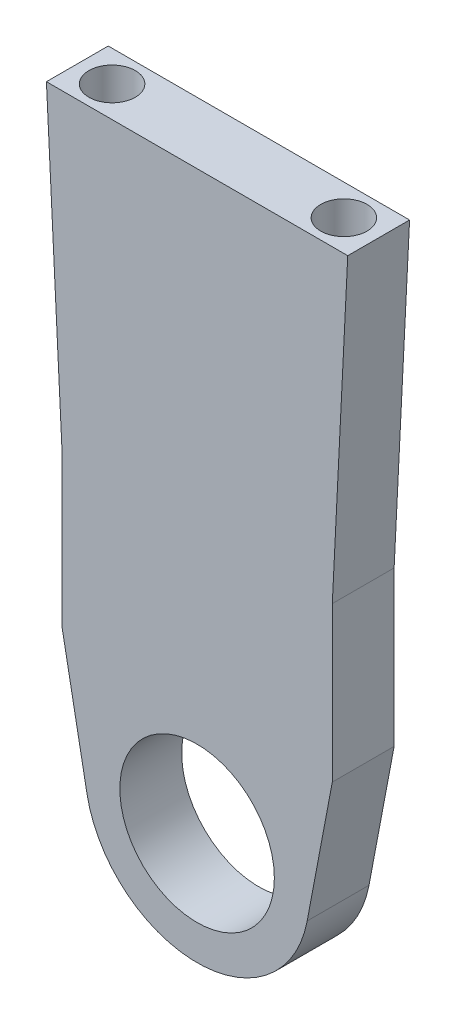
ISO-10303-21;
HEADER;
FILE_DESCRIPTION(('STEP AP214'),'2;1');
FILE_NAME('part.step','',(''),(''),'','','');
FILE_SCHEMA(('AUTOMOTIVE_DESIGN { 1 0 10303 214 1 1 1 1 }'));
ENDSEC;
DATA;
#1=APPLICATION_CONTEXT('core data for automotive mechanical design processes');
#2=APPLICATION_PROTOCOL_DEFINITION('international standard','automotive_design',2000,#1);
#3=PRODUCT_CONTEXT('',#1,'mechanical');
#4=PRODUCT('Part','Part','',(#3));
#5=PRODUCT_RELATED_PRODUCT_CATEGORY('part','',(#4));
#6=PRODUCT_DEFINITION_FORMATION('','',#4);
#7=PRODUCT_DEFINITION_CONTEXT('part definition',#1,'design');
#8=PRODUCT_DEFINITION('design','',#6,#7);
#9=PRODUCT_DEFINITION_SHAPE('','',#8);
#10=(LENGTH_UNIT() NAMED_UNIT(*) SI_UNIT(.MILLI.,.METRE.));
#11=(NAMED_UNIT(*) PLANE_ANGLE_UNIT() SI_UNIT($,.RADIAN.));
#12=(NAMED_UNIT(*) SI_UNIT($,.STERADIAN.) SOLID_ANGLE_UNIT());
#13=UNCERTAINTY_MEASURE_WITH_UNIT(LENGTH_MEASURE(1.E-05),#10,'distance_accuracy_value','');
#14=(GEOMETRIC_REPRESENTATION_CONTEXT(3) GLOBAL_UNCERTAINTY_ASSIGNED_CONTEXT((#13)) GLOBAL_UNIT_ASSIGNED_CONTEXT((#10,
#11,#12)) REPRESENTATION_CONTEXT('',''));
#15=CARTESIAN_POINT('',(0.,0.,0.));
#16=DIRECTION('',(0.,0.,1.));
#17=DIRECTION('',(1.,0.,0.));
#18=AXIS2_PLACEMENT_3D('',#15,#16,#17);
#19=CARTESIAN_POINT('',(8.75,37.25,-2.));
#20=DIRECTION('',(-1.,0.,0.));
#21=DIRECTION('',(0.,-1.,0.));
#22=AXIS2_PLACEMENT_3D('',#19,#20,#21);
#23=PLANE('',#22);
#24=DIRECTION('',(0.,0.,-1.));
#25=VECTOR('',#24,1.);
#26=CARTESIAN_POINT('',(8.75,17.25,2.));
#27=LINE('',#26,#25);
#28=CARTESIAN_POINT('',(8.75,17.25,2.));
#29=VERTEX_POINT('',#28);
#30=CARTESIAN_POINT('',(8.75,17.25,-2.));
#31=VERTEX_POINT('',#30);
#32=EDGE_CURVE('E53',#29,#31,#27,.T.);
#33=ORIENTED_EDGE('',*,*,#32,.F.);
#34=DIRECTION('',(0.,-1.,0.));
#35=VECTOR('',#34,1.);
#36=CARTESIAN_POINT('',(8.75,37.25,2.));
#37=LINE('',#36,#35);
#38=CARTESIAN_POINT('',(8.75,7.25,2.));
#39=VERTEX_POINT('',#38);
#40=EDGE_CURVE('E120',#29,#39,#37,.T.);
#41=ORIENTED_EDGE('',*,*,#40,.T.);
#42=DIRECTION('',(0.,0.,-1.));
#43=VECTOR('',#42,1.);
#44=CARTESIAN_POINT('',(8.75,7.25,2.));
#45=LINE('',#44,#43);
#46=CARTESIAN_POINT('',(8.75,7.25,-2.));
#47=VERTEX_POINT('',#46);
#48=EDGE_CURVE('E11',#39,#47,#45,.T.);
#49=ORIENTED_EDGE('',*,*,#48,.T.);
#50=DIRECTION('',(0.,-1.,0.));
#51=VECTOR('',#50,1.);
#52=CARTESIAN_POINT('',(8.75,37.25,-2.));
#53=LINE('',#52,#51);
#54=EDGE_CURVE('E140',#31,#47,#53,.T.);
#55=ORIENTED_EDGE('',*,*,#54,.F.);
#56=EDGE_LOOP('',(#33,#41,#49,#55));
#57=FACE_BOUND('',#56,.T.);
#58=ADVANCED_FACE('F38',(#57),#23,.F.);
#59=CARTESIAN_POINT('',(0.,0.,2.));
#60=DIRECTION('',(0.,0.,-1.));
#61=DIRECTION('',(-1.,0.,0.));
#62=AXIS2_PLACEMENT_3D('',#59,#60,#61);
#63=PLANE('',#62);
#64=DIRECTION('',(0.185866408518877,0.982575024201355,0.));
#65=VECTOR('',#64,1.);
#66=CARTESIAN_POINT('',(8.75,7.25,2.));
#67=LINE('',#66,#65);
#68=CARTESIAN_POINT('',(7.12366892545983,-1.34753146176186,2.));
#69=VERTEX_POINT('',#68);
#70=EDGE_CURVE('E152',#69,#39,#67,.T.);
#71=ORIENTED_EDGE('',*,*,#70,.T.);
#72=ORIENTED_EDGE('',*,*,#40,.F.);
#73=DIRECTION('',(0.0499376169438922,0.998752338877845,0.));
#74=VECTOR('',#73,1.);
#75=CARTESIAN_POINT('',(9.74999999999999,37.25,2.));
#76=LINE('',#75,#74);
#77=CARTESIAN_POINT('',(9.74999999999999,37.25,2.));
#78=VERTEX_POINT('',#77);
#79=EDGE_CURVE('E116',#29,#78,#76,.T.);
#80=ORIENTED_EDGE('',*,*,#79,.T.);
#81=DIRECTION('',(1.,0.,0.));
#82=VECTOR('',#81,1.);
#83=CARTESIAN_POINT('',(-8.75000000000001,37.25,2.));
#84=LINE('',#83,#82);
#85=CARTESIAN_POINT('',(-9.75000000000001,37.25,2.));
#86=VERTEX_POINT('',#85);
#87=EDGE_CURVE('E105',#86,#78,#84,.T.);
#88=ORIENTED_EDGE('',*,*,#87,.F.);
#89=DIRECTION('',(0.0499376169438923,-0.998752338877845,0.));
#90=VECTOR('',#89,1.);
#91=CARTESIAN_POINT('',(-9.75000000000001,37.25,2.));
#92=LINE('',#91,#90);
#93=CARTESIAN_POINT('',(-8.75,17.25,2.));
#94=VERTEX_POINT('',#93);
#95=EDGE_CURVE('E131',#86,#94,#92,.T.);
#96=ORIENTED_EDGE('',*,*,#95,.T.);
#97=DIRECTION('',(0.,-1.,0.));
#98=VECTOR('',#97,1.);
#99=CARTESIAN_POINT('',(-8.75000000000001,37.25,2.));
#100=LINE('',#99,#98);
#101=CARTESIAN_POINT('',(-8.75,7.25,2.));
#102=VERTEX_POINT('',#101);
#103=EDGE_CURVE('E143',#94,#102,#100,.T.);
#104=ORIENTED_EDGE('',*,*,#103,.T.);
#105=DIRECTION('',(0.185866408518877,-0.982575024201355,0.));
#106=VECTOR('',#105,1.);
#107=CARTESIAN_POINT('',(-8.75,7.25,2.));
#108=LINE('',#107,#106);
#109=CARTESIAN_POINT('',(-7.12366892545982,-1.34753146176186,2.));
#110=VERTEX_POINT('',#109);
#111=EDGE_CURVE('E154',#102,#110,#108,.T.);
#112=ORIENTED_EDGE('',*,*,#111,.T.);
#113=CARTESIAN_POINT('',(0.,0.,2.));
#114=DIRECTION('',(0.,0.,1.));
#115=DIRECTION('',(-1.,0.,0.));
#116=AXIS2_PLACEMENT_3D('',#113,#114,#115);
#117=CIRCLE('',#116,7.25);
#118=EDGE_CURVE('E157',#110,#69,#117,.T.);
#119=ORIENTED_EDGE('',*,*,#118,.T.);
#120=EDGE_LOOP('',(#71,#72,#80,#88,#96,#104,#112,#119));
#121=FACE_BOUND('',#120,.T.);
#122=CARTESIAN_POINT('',(0.,0.,2.));
#123=DIRECTION('',(0.,0.,1.));
#124=DIRECTION('',(1.,0.,0.));
#125=AXIS2_PLACEMENT_3D('',#122,#123,#124);
#126=CIRCLE('',#125,5.);
#127=CARTESIAN_POINT('',(5.,0.,2.));
#128=VERTEX_POINT('',#127);
#129=EDGE_CURVE('E146',#128,#128,#126,.T.);
#130=ORIENTED_EDGE('',*,*,#129,.F.);
#131=EDGE_LOOP('',(#130));
#132=FACE_BOUND('',#131,.T.);
#133=ADVANCED_FACE('F118',(#121,#132),#63,.F.);
#134=CARTESIAN_POINT('',(0.,0.,-2.));
#135=DIRECTION('',(0.,0.,-1.));
#136=DIRECTION('',(-1.,0.,0.));
#137=AXIS2_PLACEMENT_3D('',#134,#135,#136);
#138=PLANE('',#137);
#139=DIRECTION('',(0.185866408518877,0.982575024201355,0.));
#140=VECTOR('',#139,1.);
#141=CARTESIAN_POINT('',(8.75,7.25,-2.));
#142=LINE('',#141,#140);
#143=CARTESIAN_POINT('',(7.12366892545983,-1.34753146176186,-2.));
#144=VERTEX_POINT('',#143);
#145=EDGE_CURVE('E149',#144,#47,#142,.T.);
#146=ORIENTED_EDGE('',*,*,#145,.F.);
#147=CARTESIAN_POINT('',(0.,0.,-2.));
#148=DIRECTION('',(0.,0.,1.));
#149=DIRECTION('',(-1.,0.,0.));
#150=AXIS2_PLACEMENT_3D('',#147,#148,#149);
#151=CIRCLE('',#150,7.25);
#152=CARTESIAN_POINT('',(-7.12366892545982,-1.34753146176186,-2.));
#153=VERTEX_POINT('',#152);
#154=EDGE_CURVE('E155',#153,#144,#151,.T.);
#155=ORIENTED_EDGE('',*,*,#154,.F.);
#156=DIRECTION('',(0.185866408518877,-0.982575024201355,0.));
#157=VECTOR('',#156,1.);
#158=CARTESIAN_POINT('',(-8.75,7.25,-2.));
#159=LINE('',#158,#157);
#160=CARTESIAN_POINT('',(-8.75,7.25,-2.));
#161=VERTEX_POINT('',#160);
#162=EDGE_CURVE('E162',#161,#153,#159,.T.);
#163=ORIENTED_EDGE('',*,*,#162,.F.);
#164=DIRECTION('',(0.,-1.,0.));
#165=VECTOR('',#164,1.);
#166=CARTESIAN_POINT('',(-8.75000000000001,37.25,-2.));
#167=LINE('',#166,#165);
#168=CARTESIAN_POINT('',(-8.75,17.25,-2.));
#169=VERTEX_POINT('',#168);
#170=EDGE_CURVE('E138',#169,#161,#167,.T.);
#171=ORIENTED_EDGE('',*,*,#170,.F.);
#172=DIRECTION('',(0.0499376169438923,-0.998752338877845,0.));
#173=VECTOR('',#172,1.);
#174=CARTESIAN_POINT('',(-9.75000000000001,37.25,-2.));
#175=LINE('',#174,#173);
#176=CARTESIAN_POINT('',(-9.75000000000001,37.25,-2.));
#177=VERTEX_POINT('',#176);
#178=EDGE_CURVE('E61',#177,#169,#175,.T.);
#179=ORIENTED_EDGE('',*,*,#178,.F.);
#180=DIRECTION('',(-1.,0.,0.));
#181=VECTOR('',#180,1.);
#182=CARTESIAN_POINT('',(-8.75000000000001,37.25,-2.));
#183=LINE('',#182,#181);
#184=CARTESIAN_POINT('',(9.74999999999999,37.25,-2.));
#185=VERTEX_POINT('',#184);
#186=EDGE_CURVE('E113',#185,#177,#183,.T.);
#187=ORIENTED_EDGE('',*,*,#186,.F.);
#188=DIRECTION('',(0.0499376169438922,0.998752338877845,0.));
#189=VECTOR('',#188,1.);
#190=CARTESIAN_POINT('',(9.74999999999999,37.25,-2.));
#191=LINE('',#190,#189);
#192=EDGE_CURVE('E122',#31,#185,#191,.T.);
#193=ORIENTED_EDGE('',*,*,#192,.F.);
#194=ORIENTED_EDGE('',*,*,#54,.T.);
#195=EDGE_LOOP('',(#146,#155,#163,#171,#179,#187,#193,#194));
#196=FACE_BOUND('',#195,.T.);
#197=CARTESIAN_POINT('',(0.,0.,-2.));
#198=DIRECTION('',(0.,0.,1.));
#199=DIRECTION('',(1.,0.,0.));
#200=AXIS2_PLACEMENT_3D('',#197,#198,#199);
#201=CIRCLE('',#200,5.);
#202=CARTESIAN_POINT('',(5.,0.,-2.));
#203=VERTEX_POINT('',#202);
#204=EDGE_CURVE('E145',#203,#203,#201,.T.);
#205=ORIENTED_EDGE('',*,*,#204,.T.);
#206=EDGE_LOOP('',(#205));
#207=FACE_BOUND('',#206,.T.);
#208=ADVANCED_FACE('F182',(#196,#207),#138,.T.);
#209=CARTESIAN_POINT('',(8.75,7.25,2.));
#210=DIRECTION('',(-0.982575024201355,0.185866408518877,0.));
#211=DIRECTION('',(-0.185866408518877,-0.982575024201355,0.));
#212=AXIS2_PLACEMENT_3D('',#209,#210,#211);
#213=PLANE('',#212);
#214=ORIENTED_EDGE('',*,*,#145,.T.);
#215=ORIENTED_EDGE('',*,*,#48,.F.);
#216=ORIENTED_EDGE('',*,*,#70,.F.);
#217=DIRECTION('',(0.,0.,-1.));
#218=VECTOR('',#217,1.);
#219=CARTESIAN_POINT('',(7.12366892545983,-1.34753146176186,2.));
#220=LINE('',#219,#218);
#221=EDGE_CURVE('E159',#69,#144,#220,.T.);
#222=ORIENTED_EDGE('',*,*,#221,.T.);
#223=EDGE_LOOP('',(#214,#215,#216,#222));
#224=FACE_BOUND('',#223,.T.);
#225=ADVANCED_FACE('F40',(#224),#213,.F.);
#226=CARTESIAN_POINT('',(-8.75,7.25,2.));
#227=DIRECTION('',(0.982575024201355,0.185866408518877,0.));
#228=DIRECTION('',(-0.185866408518877,0.982575024201355,0.));
#229=AXIS2_PLACEMENT_3D('',#226,#227,#228);
#230=PLANE('',#229);
#231=ORIENTED_EDGE('',*,*,#162,.T.);
#232=DIRECTION('',(0.,0.,-1.));
#233=VECTOR('',#232,1.);
#234=CARTESIAN_POINT('',(-7.12366892545982,-1.34753146176186,2.));
#235=LINE('',#234,#233);
#236=EDGE_CURVE('E167',#110,#153,#235,.T.);
#237=ORIENTED_EDGE('',*,*,#236,.F.);
#238=ORIENTED_EDGE('',*,*,#111,.F.);
#239=DIRECTION('',(0.,0.,-1.));
#240=VECTOR('',#239,1.);
#241=CARTESIAN_POINT('',(-8.75,7.25,2.));
#242=LINE('',#241,#240);
#243=EDGE_CURVE('E46',#102,#161,#242,.T.);
#244=ORIENTED_EDGE('',*,*,#243,.T.);
#245=EDGE_LOOP('',(#231,#237,#238,#244));
#246=FACE_BOUND('',#245,.T.);
#247=ADVANCED_FACE('F174',(#246),#230,.F.);
#248=CARTESIAN_POINT('',(0.,0.,2.));
#249=DIRECTION('',(0.,0.,-1.));
#250=DIRECTION('',(-1.,0.,0.));
#251=AXIS2_PLACEMENT_3D('',#248,#249,#250);
#252=CYLINDRICAL_SURFACE('',#251,7.25);
#253=ORIENTED_EDGE('',*,*,#154,.T.);
#254=ORIENTED_EDGE('',*,*,#221,.F.);
#255=ORIENTED_EDGE('',*,*,#118,.F.);
#256=ORIENTED_EDGE('',*,*,#236,.T.);
#257=EDGE_LOOP('',(#253,#254,#255,#256));
#258=FACE_BOUND('',#257,.T.);
#259=ADVANCED_FACE('F186',(#258),#252,.T.);
#260=CARTESIAN_POINT('',(0.,0.,2.));
#261=DIRECTION('',(0.,0.,-1.));
#262=DIRECTION('',(-1.,0.,0.));
#263=AXIS2_PLACEMENT_3D('',#260,#261,#262);
#264=CYLINDRICAL_SURFACE('',#263,5.);
#265=ORIENTED_EDGE('',*,*,#129,.T.);
#266=EDGE_LOOP('',(#265));
#267=FACE_BOUND('',#266,.T.);
#268=ORIENTED_EDGE('',*,*,#204,.F.);
#269=EDGE_LOOP('',(#268));
#270=FACE_BOUND('',#269,.T.);
#271=ADVANCED_FACE('F219',(#267,#270),#264,.F.);
#272=CARTESIAN_POINT('',(-8.75000000000001,37.25,-2.));
#273=DIRECTION('',(1.,0.,0.));
#274=DIRECTION('',(0.,1.,0.));
#275=AXIS2_PLACEMENT_3D('',#272,#273,#274);
#276=PLANE('',#275);
#277=ORIENTED_EDGE('',*,*,#103,.F.);
#278=DIRECTION('',(0.,0.,-1.));
#279=VECTOR('',#278,1.);
#280=CARTESIAN_POINT('',(-8.75,17.25,2.));
#281=LINE('',#280,#279);
#282=EDGE_CURVE('E133',#94,#169,#281,.T.);
#283=ORIENTED_EDGE('',*,*,#282,.T.);
#284=ORIENTED_EDGE('',*,*,#170,.T.);
#285=ORIENTED_EDGE('',*,*,#243,.F.);
#286=EDGE_LOOP('',(#277,#283,#284,#285));
#287=FACE_BOUND('',#286,.T.);
#288=ADVANCED_FACE('F191',(#287),#276,.F.);
#289=CARTESIAN_POINT('',(0.,37.25,0.));
#290=DIRECTION('',(0.,1.,0.));
#291=DIRECTION('',(-1.,0.,0.));
#292=AXIS2_PLACEMENT_3D('',#289,#290,#291);
#293=PLANE('',#292);
#294=CARTESIAN_POINT('',(-7.50000000000001,37.25,0.));
#295=DIRECTION('',(0.,1.,0.));
#296=DIRECTION('',(-1.,0.,0.));
#297=AXIS2_PLACEMENT_3D('',#294,#295,#296);
#298=CIRCLE('',#297,1.5);
#299=CARTESIAN_POINT('',(-9.00000000000001,37.25,0.));
#300=VERTEX_POINT('',#299);
#301=EDGE_CURVE('E195',#300,#300,#298,.T.);
#302=ORIENTED_EDGE('',*,*,#301,.F.);
#303=EDGE_LOOP('',(#302));
#304=FACE_BOUND('',#303,.T.);
#305=CARTESIAN_POINT('',(7.49999999999999,37.25,0.));
#306=DIRECTION('',(0.,1.,0.));
#307=DIRECTION('',(-1.,0.,0.));
#308=AXIS2_PLACEMENT_3D('',#305,#306,#307);
#309=CIRCLE('',#308,1.5);
#310=CARTESIAN_POINT('',(5.99999999999999,37.25,0.));
#311=VERTEX_POINT('',#310);
#312=EDGE_CURVE('E205',#311,#311,#309,.T.);
#313=ORIENTED_EDGE('',*,*,#312,.F.);
#314=EDGE_LOOP('',(#313));
#315=FACE_BOUND('',#314,.T.);
#316=ORIENTED_EDGE('',*,*,#186,.T.);
#317=DIRECTION('',(0.,0.,-1.));
#318=VECTOR('',#317,1.);
#319=CARTESIAN_POINT('',(-9.75000000000001,37.25,2.));
#320=LINE('',#319,#318);
#321=EDGE_CURVE('E110',#86,#177,#320,.T.);
#322=ORIENTED_EDGE('',*,*,#321,.F.);
#323=ORIENTED_EDGE('',*,*,#87,.T.);
#324=DIRECTION('',(0.,0.,-1.));
#325=VECTOR('',#324,1.);
#326=CARTESIAN_POINT('',(9.74999999999999,37.25,2.));
#327=LINE('',#326,#325);
#328=EDGE_CURVE('E109',#78,#185,#327,.T.);
#329=ORIENTED_EDGE('',*,*,#328,.T.);
#330=EDGE_LOOP('',(#316,#322,#323,#329));
#331=FACE_BOUND('',#330,.T.);
#332=ADVANCED_FACE('F107',(#304,#315,#331),#293,.T.);
#333=CARTESIAN_POINT('',(-9.75000000000001,37.25,2.));
#334=DIRECTION('',(0.998752338877845,0.0499376169438923,0.));
#335=DIRECTION('',(-0.0499376169438923,0.998752338877845,0.));
#336=AXIS2_PLACEMENT_3D('',#333,#334,#335);
#337=PLANE('',#336);
#338=ORIENTED_EDGE('',*,*,#178,.T.);
#339=ORIENTED_EDGE('',*,*,#282,.F.);
#340=ORIENTED_EDGE('',*,*,#95,.F.);
#341=ORIENTED_EDGE('',*,*,#321,.T.);
#342=EDGE_LOOP('',(#338,#339,#340,#341));
#343=FACE_BOUND('',#342,.T.);
#344=ADVANCED_FACE('F192',(#343),#337,.F.);
#345=CARTESIAN_POINT('',(9.74999999999999,37.25,2.));
#346=DIRECTION('',(-0.998752338877845,0.0499376169438922,0.));
#347=DIRECTION('',(-0.0499376169438922,-0.998752338877845,0.));
#348=AXIS2_PLACEMENT_3D('',#345,#346,#347);
#349=PLANE('',#348);
#350=ORIENTED_EDGE('',*,*,#192,.T.);
#351=ORIENTED_EDGE('',*,*,#328,.F.);
#352=ORIENTED_EDGE('',*,*,#79,.F.);
#353=ORIENTED_EDGE('',*,*,#32,.T.);
#354=EDGE_LOOP('',(#350,#351,#352,#353));
#355=FACE_BOUND('',#354,.T.);
#356=ADVANCED_FACE('F125',(#355),#349,.F.);
#357=CARTESIAN_POINT('',(7.49999999999999,31.25,0.));
#358=DIRECTION('',(0.,1.,0.));
#359=DIRECTION('',(-1.,0.,0.));
#360=AXIS2_PLACEMENT_3D('',#357,#358,#359);
#361=CYLINDRICAL_SURFACE('',#360,1.5);
#362=CARTESIAN_POINT('',(7.49999999999999,31.25,0.));
#363=DIRECTION('',(0.,1.,0.));
#364=DIRECTION('',(-1.,0.,0.));
#365=AXIS2_PLACEMENT_3D('',#362,#363,#364);
#366=CIRCLE('',#365,1.5);
#367=CARTESIAN_POINT('',(5.99999999999999,31.25,0.));
#368=VERTEX_POINT('',#367);
#369=EDGE_CURVE('E200',#368,#368,#366,.T.);
#370=ORIENTED_EDGE('',*,*,#369,.F.);
#371=EDGE_LOOP('',(#370));
#372=FACE_BOUND('',#371,.T.);
#373=ORIENTED_EDGE('',*,*,#312,.T.);
#374=EDGE_LOOP('',(#373));
#375=FACE_BOUND('',#374,.T.);
#376=ADVANCED_FACE('F209',(#372,#375),#361,.F.);
#377=CARTESIAN_POINT('',(7.49999999999999,31.25,0.));
#378=DIRECTION('',(0.,1.,0.));
#379=DIRECTION('',(-1.,0.,0.));
#380=AXIS2_PLACEMENT_3D('',#377,#378,#379);
#381=PLANE('',#380);
#382=ORIENTED_EDGE('',*,*,#369,.T.);
#383=EDGE_LOOP('',(#382));
#384=FACE_BOUND('',#383,.T.);
#385=ADVANCED_FACE('F326',(#384),#381,.T.);
#386=CARTESIAN_POINT('',(-7.50000000000001,31.25,0.));
#387=DIRECTION('',(0.,1.,0.));
#388=DIRECTION('',(-1.,0.,0.));
#389=AXIS2_PLACEMENT_3D('',#386,#387,#388);
#390=CYLINDRICAL_SURFACE('',#389,1.5);
#391=CARTESIAN_POINT('',(-7.50000000000001,31.25,0.));
#392=DIRECTION('',(0.,1.,0.));
#393=DIRECTION('',(-1.,0.,0.));
#394=AXIS2_PLACEMENT_3D('',#391,#392,#393);
#395=CIRCLE('',#394,1.5);
#396=CARTESIAN_POINT('',(-9.00000000000001,31.25,0.));
#397=VERTEX_POINT('',#396);
#398=EDGE_CURVE('E193',#397,#397,#395,.T.);
#399=ORIENTED_EDGE('',*,*,#398,.F.);
#400=EDGE_LOOP('',(#399));
#401=FACE_BOUND('',#400,.T.);
#402=ORIENTED_EDGE('',*,*,#301,.T.);
#403=EDGE_LOOP('',(#402));
#404=FACE_BOUND('',#403,.T.);
#405=ADVANCED_FACE('F335',(#401,#404),#390,.F.);
#406=CARTESIAN_POINT('',(-7.50000000000001,31.25,0.));
#407=DIRECTION('',(0.,1.,0.));
#408=DIRECTION('',(-1.,0.,0.));
#409=AXIS2_PLACEMENT_3D('',#406,#407,#408);
#410=PLANE('',#409);
#411=ORIENTED_EDGE('',*,*,#398,.T.);
#412=EDGE_LOOP('',(#411));
#413=FACE_BOUND('',#412,.T.);
#414=ADVANCED_FACE('F344',(#413),#410,.T.);
#415=CLOSED_SHELL('',(#58,#133,#208,#225,#247,#259,#271,#288,#332,#344,#356,#376,#385,#405,#414));
#416=MANIFOLD_SOLID_BREP('B2',#415);
#417=ADVANCED_BREP_SHAPE_REPRESENTATION('',(#18,#416),#14);
#418=SHAPE_DEFINITION_REPRESENTATION(#9,#417);
ENDSEC;
END-ISO-10303-21;
